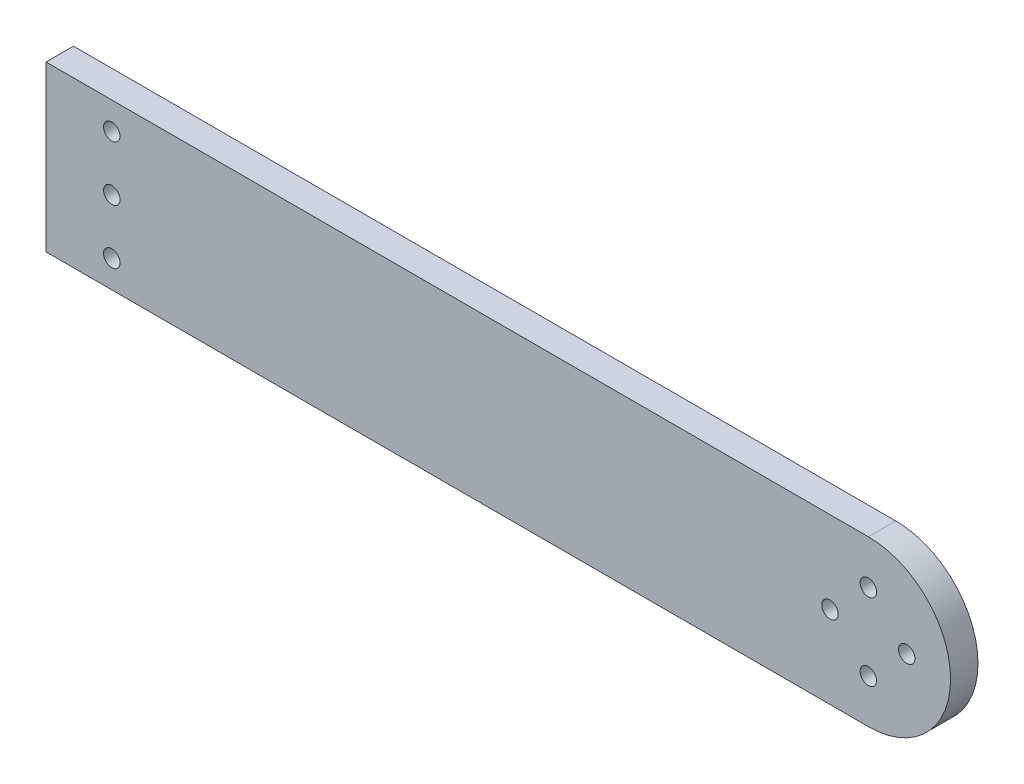
ISO-10303-21;
HEADER;
FILE_DESCRIPTION(('STEP AP214'),'2;1');
FILE_NAME('part.step','',(''),(''),'','','');
FILE_SCHEMA(('AUTOMOTIVE_DESIGN { 1 0 10303 214 1 1 1 1 }'));
ENDSEC;
DATA;
#1=APPLICATION_CONTEXT('core data for automotive mechanical design processes');
#2=APPLICATION_PROTOCOL_DEFINITION('international standard','automotive_design',2000,#1);
#3=PRODUCT_CONTEXT('',#1,'mechanical');
#4=PRODUCT('Part','Part','',(#3));
#5=PRODUCT_RELATED_PRODUCT_CATEGORY('part','',(#4));
#6=PRODUCT_DEFINITION_FORMATION('','',#4);
#7=PRODUCT_DEFINITION_CONTEXT('part definition',#1,'design');
#8=PRODUCT_DEFINITION('design','',#6,#7);
#9=PRODUCT_DEFINITION_SHAPE('','',#8);
#10=(LENGTH_UNIT() NAMED_UNIT(*) SI_UNIT(.MILLI.,.METRE.));
#11=(NAMED_UNIT(*) PLANE_ANGLE_UNIT() SI_UNIT($,.RADIAN.));
#12=(NAMED_UNIT(*) SI_UNIT($,.STERADIAN.) SOLID_ANGLE_UNIT());
#13=UNCERTAINTY_MEASURE_WITH_UNIT(LENGTH_MEASURE(1.E-05),#10,'distance_accuracy_value','');
#14=(GEOMETRIC_REPRESENTATION_CONTEXT(3) GLOBAL_UNCERTAINTY_ASSIGNED_CONTEXT((#13)) GLOBAL_UNIT_ASSIGNED_CONTEXT((#10,
#11,#12)) REPRESENTATION_CONTEXT('',''));
#15=CARTESIAN_POINT('',(0.,0.,0.));
#16=DIRECTION('',(0.,0.,1.));
#17=DIRECTION('',(1.,0.,0.));
#18=AXIS2_PLACEMENT_3D('',#15,#16,#17);
#19=CARTESIAN_POINT('',(74.9999997922791,0.,5.));
#20=DIRECTION('',(0.,0.,1.));
#21=DIRECTION('',(1.,0.,0.));
#22=AXIS2_PLACEMENT_3D('',#19,#20,#21);
#23=PLANE('',#22);
#24=CARTESIAN_POINT('',(-63.0000002077209,10.,5.));
#25=DIRECTION('',(0.,0.,1.));
#26=DIRECTION('',(1.,0.,0.));
#27=AXIS2_PLACEMENT_3D('',#24,#25,#26);
#28=CIRCLE('',#27,1.5);
#29=CARTESIAN_POINT('',(-61.5000002077209,10.,5.));
#30=VERTEX_POINT('',#29);
#31=EDGE_CURVE('E145',#30,#30,#28,.T.);
#32=ORIENTED_EDGE('',*,*,#31,.F.);
#33=EDGE_LOOP('',(#32));
#34=FACE_BOUND('',#33,.T.);
#35=CARTESIAN_POINT('',(75.,-7.,5.));
#36=DIRECTION('',(0.,0.,1.));
#37=DIRECTION('',(-1.,0.,0.));
#38=AXIS2_PLACEMENT_3D('',#35,#36,#37);
#39=CIRCLE('',#38,1.5);
#40=CARTESIAN_POINT('',(73.5,-7.,5.));
#41=VERTEX_POINT('',#40);
#42=EDGE_CURVE('E133',#41,#41,#39,.T.);
#43=ORIENTED_EDGE('',*,*,#42,.F.);
#44=EDGE_LOOP('',(#43));
#45=FACE_BOUND('',#44,.T.);
#46=CARTESIAN_POINT('',(82.,0.,5.));
#47=DIRECTION('',(0.,0.,1.));
#48=DIRECTION('',(1.,0.,0.));
#49=AXIS2_PLACEMENT_3D('',#46,#47,#48);
#50=CIRCLE('',#49,1.5);
#51=CARTESIAN_POINT('',(83.5,0.,5.));
#52=VERTEX_POINT('',#51);
#53=EDGE_CURVE('E121',#52,#52,#50,.T.);
#54=ORIENTED_EDGE('',*,*,#53,.F.);
#55=EDGE_LOOP('',(#54));
#56=FACE_BOUND('',#55,.T.);
#57=DIRECTION('',(0.,-1.,0.));
#58=VECTOR('',#57,1.);
#59=CARTESIAN_POINT('',(-75.0000002077209,-15.,5.));
#60=LINE('',#59,#58);
#61=CARTESIAN_POINT('',(-75.0000002077209,15.,5.));
#62=VERTEX_POINT('',#61);
#63=CARTESIAN_POINT('',(-75.0000002077209,-15.,5.));
#64=VERTEX_POINT('',#63);
#65=EDGE_CURVE('E91',#62,#64,#60,.T.);
#66=ORIENTED_EDGE('',*,*,#65,.T.);
#67=DIRECTION('',(1.,0.,0.));
#68=VECTOR('',#67,1.);
#69=CARTESIAN_POINT('',(75.0000002077208,-15.,5.));
#70=LINE('',#69,#68);
#71=CARTESIAN_POINT('',(75.0000002077208,-15.,5.));
#72=VERTEX_POINT('',#71);
#73=EDGE_CURVE('E86',#64,#72,#70,.T.);
#74=ORIENTED_EDGE('',*,*,#73,.T.);
#75=CARTESIAN_POINT('',(74.9999997922791,0.,5.));
#76=DIRECTION('',(0.,0.,1.));
#77=DIRECTION('',(1.,0.,0.));
#78=AXIS2_PLACEMENT_3D('',#75,#76,#77);
#79=CIRCLE('',#78,15.);
#80=CARTESIAN_POINT('',(75.0000002077209,15.,5.));
#81=VERTEX_POINT('',#80);
#82=EDGE_CURVE('E89',#72,#81,#79,.T.);
#83=ORIENTED_EDGE('',*,*,#82,.T.);
#84=DIRECTION('',(-1.,0.,0.));
#85=VECTOR('',#84,1.);
#86=CARTESIAN_POINT('',(75.0000002077209,15.,5.));
#87=LINE('',#86,#85);
#88=EDGE_CURVE('E56',#81,#62,#87,.T.);
#89=ORIENTED_EDGE('',*,*,#88,.T.);
#90=EDGE_LOOP('',(#66,#74,#83,#89));
#91=FACE_BOUND('',#90,.T.);
#92=CARTESIAN_POINT('',(75.,7.,5.));
#93=DIRECTION('',(0.,0.,1.));
#94=DIRECTION('',(1.,0.,0.));
#95=AXIS2_PLACEMENT_3D('',#92,#93,#94);
#96=CIRCLE('',#95,1.5);
#97=CARTESIAN_POINT('',(76.5,7.,5.));
#98=VERTEX_POINT('',#97);
#99=EDGE_CURVE('E106',#98,#98,#96,.T.);
#100=ORIENTED_EDGE('',*,*,#99,.F.);
#101=EDGE_LOOP('',(#100));
#102=FACE_BOUND('',#101,.T.);
#103=CARTESIAN_POINT('',(68.,0.,5.));
#104=DIRECTION('',(0.,0.,1.));
#105=DIRECTION('',(-1.,0.,0.));
#106=AXIS2_PLACEMENT_3D('',#103,#104,#105);
#107=CIRCLE('',#106,1.5);
#108=CARTESIAN_POINT('',(66.5,0.,5.));
#109=VERTEX_POINT('',#108);
#110=EDGE_CURVE('E127',#109,#109,#107,.T.);
#111=ORIENTED_EDGE('',*,*,#110,.F.);
#112=EDGE_LOOP('',(#111));
#113=FACE_BOUND('',#112,.T.);
#114=CARTESIAN_POINT('',(-63.0000002077209,0.,5.));
#115=DIRECTION('',(0.,0.,1.));
#116=DIRECTION('',(1.,0.,0.));
#117=AXIS2_PLACEMENT_3D('',#114,#115,#116);
#118=CIRCLE('',#117,1.5);
#119=CARTESIAN_POINT('',(-61.5000002077209,0.,5.));
#120=VERTEX_POINT('',#119);
#121=EDGE_CURVE('E139',#120,#120,#118,.T.);
#122=ORIENTED_EDGE('',*,*,#121,.F.);
#123=EDGE_LOOP('',(#122));
#124=FACE_BOUND('',#123,.T.);
#125=CARTESIAN_POINT('',(-63.0000002077209,-10.,5.));
#126=DIRECTION('',(0.,0.,1.));
#127=DIRECTION('',(1.,0.,0.));
#128=AXIS2_PLACEMENT_3D('',#125,#126,#127);
#129=CIRCLE('',#128,1.5);
#130=CARTESIAN_POINT('',(-61.5000002077209,-10.,5.));
#131=VERTEX_POINT('',#130);
#132=EDGE_CURVE('E151',#131,#131,#129,.T.);
#133=ORIENTED_EDGE('',*,*,#132,.F.);
#134=EDGE_LOOP('',(#133));
#135=FACE_BOUND('',#134,.T.);
#136=ADVANCED_FACE('F39',(#34,#45,#56,#91,#102,#113,#124,#135),#23,.T.);
#137=CARTESIAN_POINT('',(74.9999997922791,0.,0.));
#138=DIRECTION('',(0.,0.,1.));
#139=DIRECTION('',(1.,0.,0.));
#140=AXIS2_PLACEMENT_3D('',#137,#138,#139);
#141=PLANE('',#140);
#142=DIRECTION('',(0.,-1.,0.));
#143=VECTOR('',#142,1.);
#144=CARTESIAN_POINT('',(-75.0000002077209,-15.,0.));
#145=LINE('',#144,#143);
#146=CARTESIAN_POINT('',(-75.0000002077209,15.,0.));
#147=VERTEX_POINT('',#146);
#148=CARTESIAN_POINT('',(-75.0000002077209,-15.,0.));
#149=VERTEX_POINT('',#148);
#150=EDGE_CURVE('E103',#147,#149,#145,.T.);
#151=ORIENTED_EDGE('',*,*,#150,.F.);
#152=DIRECTION('',(-1.,0.,0.));
#153=VECTOR('',#152,1.);
#154=CARTESIAN_POINT('',(75.0000002077209,15.,0.));
#155=LINE('',#154,#153);
#156=CARTESIAN_POINT('',(75.0000002077209,15.,0.));
#157=VERTEX_POINT('',#156);
#158=EDGE_CURVE('E79',#157,#147,#155,.T.);
#159=ORIENTED_EDGE('',*,*,#158,.F.);
#160=CARTESIAN_POINT('',(74.9999997922791,0.,0.));
#161=DIRECTION('',(0.,0.,1.));
#162=DIRECTION('',(1.,0.,0.));
#163=AXIS2_PLACEMENT_3D('',#160,#161,#162);
#164=CIRCLE('',#163,15.);
#165=CARTESIAN_POINT('',(75.0000002077208,-15.,0.));
#166=VERTEX_POINT('',#165);
#167=EDGE_CURVE('E73',#166,#157,#164,.T.);
#168=ORIENTED_EDGE('',*,*,#167,.F.);
#169=DIRECTION('',(1.,0.,0.));
#170=VECTOR('',#169,1.);
#171=CARTESIAN_POINT('',(75.0000002077208,-15.,0.));
#172=LINE('',#171,#170);
#173=EDGE_CURVE('E95',#149,#166,#172,.T.);
#174=ORIENTED_EDGE('',*,*,#173,.F.);
#175=EDGE_LOOP('',(#151,#159,#168,#174));
#176=FACE_BOUND('',#175,.T.);
#177=CARTESIAN_POINT('',(75.,7.,0.));
#178=DIRECTION('',(0.,0.,1.));
#179=DIRECTION('',(1.,0.,0.));
#180=AXIS2_PLACEMENT_3D('',#177,#178,#179);
#181=CIRCLE('',#180,1.5);
#182=CARTESIAN_POINT('',(76.5,7.,0.));
#183=VERTEX_POINT('',#182);
#184=EDGE_CURVE('E118',#183,#183,#181,.T.);
#185=ORIENTED_EDGE('',*,*,#184,.T.);
#186=EDGE_LOOP('',(#185));
#187=FACE_BOUND('',#186,.T.);
#188=CARTESIAN_POINT('',(82.,0.,0.));
#189=DIRECTION('',(0.,0.,1.));
#190=DIRECTION('',(1.,0.,0.));
#191=AXIS2_PLACEMENT_3D('',#188,#189,#190);
#192=CIRCLE('',#191,1.5);
#193=CARTESIAN_POINT('',(83.5,0.,0.));
#194=VERTEX_POINT('',#193);
#195=EDGE_CURVE('E124',#194,#194,#192,.T.);
#196=ORIENTED_EDGE('',*,*,#195,.T.);
#197=EDGE_LOOP('',(#196));
#198=FACE_BOUND('',#197,.T.);
#199=CARTESIAN_POINT('',(68.,0.,0.));
#200=DIRECTION('',(0.,0.,1.));
#201=DIRECTION('',(-1.,0.,0.));
#202=AXIS2_PLACEMENT_3D('',#199,#200,#201);
#203=CIRCLE('',#202,1.5);
#204=CARTESIAN_POINT('',(66.5,0.,0.));
#205=VERTEX_POINT('',#204);
#206=EDGE_CURVE('E130',#205,#205,#203,.T.);
#207=ORIENTED_EDGE('',*,*,#206,.T.);
#208=EDGE_LOOP('',(#207));
#209=FACE_BOUND('',#208,.T.);
#210=CARTESIAN_POINT('',(75.,-7.,0.));
#211=DIRECTION('',(0.,0.,1.));
#212=DIRECTION('',(-1.,0.,0.));
#213=AXIS2_PLACEMENT_3D('',#210,#211,#212);
#214=CIRCLE('',#213,1.5);
#215=CARTESIAN_POINT('',(73.5,-7.,0.));
#216=VERTEX_POINT('',#215);
#217=EDGE_CURVE('E136',#216,#216,#214,.T.);
#218=ORIENTED_EDGE('',*,*,#217,.T.);
#219=EDGE_LOOP('',(#218));
#220=FACE_BOUND('',#219,.T.);
#221=CARTESIAN_POINT('',(-63.0000002077209,0.,0.));
#222=DIRECTION('',(0.,0.,1.));
#223=DIRECTION('',(1.,0.,0.));
#224=AXIS2_PLACEMENT_3D('',#221,#222,#223);
#225=CIRCLE('',#224,1.5);
#226=CARTESIAN_POINT('',(-61.5000002077209,0.,0.));
#227=VERTEX_POINT('',#226);
#228=EDGE_CURVE('E142',#227,#227,#225,.T.);
#229=ORIENTED_EDGE('',*,*,#228,.T.);
#230=EDGE_LOOP('',(#229));
#231=FACE_BOUND('',#230,.T.);
#232=CARTESIAN_POINT('',(-63.0000002077209,10.,0.));
#233=DIRECTION('',(0.,0.,1.));
#234=DIRECTION('',(1.,0.,0.));
#235=AXIS2_PLACEMENT_3D('',#232,#233,#234);
#236=CIRCLE('',#235,1.5);
#237=CARTESIAN_POINT('',(-61.5000002077209,10.,0.));
#238=VERTEX_POINT('',#237);
#239=EDGE_CURVE('E148',#238,#238,#236,.T.);
#240=ORIENTED_EDGE('',*,*,#239,.T.);
#241=EDGE_LOOP('',(#240));
#242=FACE_BOUND('',#241,.T.);
#243=CARTESIAN_POINT('',(-63.0000002077209,-10.,0.));
#244=DIRECTION('',(0.,0.,1.));
#245=DIRECTION('',(1.,0.,0.));
#246=AXIS2_PLACEMENT_3D('',#243,#244,#245);
#247=CIRCLE('',#246,1.5);
#248=CARTESIAN_POINT('',(-61.5000002077209,-10.,0.));
#249=VERTEX_POINT('',#248);
#250=EDGE_CURVE('E154',#249,#249,#247,.T.);
#251=ORIENTED_EDGE('',*,*,#250,.T.);
#252=EDGE_LOOP('',(#251));
#253=FACE_BOUND('',#252,.T.);
#254=ADVANCED_FACE('F114',(#176,#187,#198,#209,#220,#231,#242,#253),#141,.F.);
#255=CARTESIAN_POINT('',(-75.0000002077209,-15.,5.));
#256=DIRECTION('',(1.,0.,0.));
#257=DIRECTION('',(0.,0.,-1.));
#258=AXIS2_PLACEMENT_3D('',#255,#256,#257);
#259=PLANE('',#258);
#260=ORIENTED_EDGE('',*,*,#150,.T.);
#261=DIRECTION('',(0.,0.,-1.));
#262=VECTOR('',#261,1.);
#263=CARTESIAN_POINT('',(-75.0000002077209,-15.,5.));
#264=LINE('',#263,#262);
#265=EDGE_CURVE('E11',#64,#149,#264,.T.);
#266=ORIENTED_EDGE('',*,*,#265,.F.);
#267=ORIENTED_EDGE('',*,*,#65,.F.);
#268=DIRECTION('',(0.,0.,-1.));
#269=VECTOR('',#268,1.);
#270=CARTESIAN_POINT('',(-75.0000002077209,15.,5.));
#271=LINE('',#270,#269);
#272=EDGE_CURVE('E99',#62,#147,#271,.T.);
#273=ORIENTED_EDGE('',*,*,#272,.T.);
#274=EDGE_LOOP('',(#260,#266,#267,#273));
#275=FACE_BOUND('',#274,.T.);
#276=ADVANCED_FACE('F41',(#275),#259,.F.);
#277=CARTESIAN_POINT('',(75.0000002077208,-15.,5.));
#278=DIRECTION('',(0.,1.,0.));
#279=DIRECTION('',(0.,0.,1.));
#280=AXIS2_PLACEMENT_3D('',#277,#278,#279);
#281=PLANE('',#280);
#282=ORIENTED_EDGE('',*,*,#173,.T.);
#283=DIRECTION('',(0.,0.,-1.));
#284=VECTOR('',#283,1.);
#285=CARTESIAN_POINT('',(75.0000002077208,-15.,5.));
#286=LINE('',#285,#284);
#287=EDGE_CURVE('E48',#72,#166,#286,.T.);
#288=ORIENTED_EDGE('',*,*,#287,.F.);
#289=ORIENTED_EDGE('',*,*,#73,.F.);
#290=ORIENTED_EDGE('',*,*,#265,.T.);
#291=EDGE_LOOP('',(#282,#288,#289,#290));
#292=FACE_BOUND('',#291,.T.);
#293=ADVANCED_FACE('F94',(#292),#281,.F.);
#294=CARTESIAN_POINT('',(74.9999997922791,0.,5.));
#295=DIRECTION('',(0.,0.,-1.));
#296=DIRECTION('',(-1.,0.,0.));
#297=AXIS2_PLACEMENT_3D('',#294,#295,#296);
#298=CYLINDRICAL_SURFACE('',#297,15.);
#299=ORIENTED_EDGE('',*,*,#167,.T.);
#300=DIRECTION('',(0.,0.,-1.));
#301=VECTOR('',#300,1.);
#302=CARTESIAN_POINT('',(75.0000002077209,15.,5.));
#303=LINE('',#302,#301);
#304=EDGE_CURVE('E96',#81,#157,#303,.T.);
#305=ORIENTED_EDGE('',*,*,#304,.F.);
#306=ORIENTED_EDGE('',*,*,#82,.F.);
#307=ORIENTED_EDGE('',*,*,#287,.T.);
#308=EDGE_LOOP('',(#299,#305,#306,#307));
#309=FACE_BOUND('',#308,.T.);
#310=ADVANCED_FACE('F97',(#309),#298,.T.);
#311=CARTESIAN_POINT('',(75.0000002077209,15.,5.));
#312=DIRECTION('',(0.,-1.,0.));
#313=DIRECTION('',(0.,0.,-1.));
#314=AXIS2_PLACEMENT_3D('',#311,#312,#313);
#315=PLANE('',#314);
#316=ORIENTED_EDGE('',*,*,#158,.T.);
#317=ORIENTED_EDGE('',*,*,#272,.F.);
#318=ORIENTED_EDGE('',*,*,#88,.F.);
#319=ORIENTED_EDGE('',*,*,#304,.T.);
#320=EDGE_LOOP('',(#316,#317,#318,#319));
#321=FACE_BOUND('',#320,.T.);
#322=ADVANCED_FACE('F111',(#321),#315,.F.);
#323=CARTESIAN_POINT('',(75.,7.,5.));
#324=DIRECTION('',(0.,0.,-1.));
#325=DIRECTION('',(-1.,0.,0.));
#326=AXIS2_PLACEMENT_3D('',#323,#324,#325);
#327=CYLINDRICAL_SURFACE('',#326,1.5);
#328=ORIENTED_EDGE('',*,*,#99,.T.);
#329=EDGE_LOOP('',(#328));
#330=FACE_BOUND('',#329,.T.);
#331=ORIENTED_EDGE('',*,*,#184,.F.);
#332=EDGE_LOOP('',(#331));
#333=FACE_BOUND('',#332,.T.);
#334=ADVANCED_FACE('F173',(#330,#333),#327,.F.);
#335=CARTESIAN_POINT('',(82.,0.,5.));
#336=DIRECTION('',(0.,0.,-1.));
#337=DIRECTION('',(-1.,0.,0.));
#338=AXIS2_PLACEMENT_3D('',#335,#336,#337);
#339=CYLINDRICAL_SURFACE('',#338,1.5);
#340=ORIENTED_EDGE('',*,*,#53,.T.);
#341=EDGE_LOOP('',(#340));
#342=FACE_BOUND('',#341,.T.);
#343=ORIENTED_EDGE('',*,*,#195,.F.);
#344=EDGE_LOOP('',(#343));
#345=FACE_BOUND('',#344,.T.);
#346=ADVANCED_FACE('F218',(#342,#345),#339,.F.);
#347=CARTESIAN_POINT('',(68.,0.,5.));
#348=DIRECTION('',(0.,0.,-1.));
#349=DIRECTION('',(-1.,0.,0.));
#350=AXIS2_PLACEMENT_3D('',#347,#348,#349);
#351=CYLINDRICAL_SURFACE('',#350,1.5);
#352=ORIENTED_EDGE('',*,*,#110,.T.);
#353=EDGE_LOOP('',(#352));
#354=FACE_BOUND('',#353,.T.);
#355=ORIENTED_EDGE('',*,*,#206,.F.);
#356=EDGE_LOOP('',(#355));
#357=FACE_BOUND('',#356,.T.);
#358=ADVANCED_FACE('F226',(#354,#357),#351,.F.);
#359=CARTESIAN_POINT('',(75.,-7.,5.));
#360=DIRECTION('',(0.,0.,-1.));
#361=DIRECTION('',(-1.,0.,0.));
#362=AXIS2_PLACEMENT_3D('',#359,#360,#361);
#363=CYLINDRICAL_SURFACE('',#362,1.5);
#364=ORIENTED_EDGE('',*,*,#42,.T.);
#365=EDGE_LOOP('',(#364));
#366=FACE_BOUND('',#365,.T.);
#367=ORIENTED_EDGE('',*,*,#217,.F.);
#368=EDGE_LOOP('',(#367));
#369=FACE_BOUND('',#368,.T.);
#370=ADVANCED_FACE('F234',(#366,#369),#363,.F.);
#371=CARTESIAN_POINT('',(-63.0000002077209,0.,5.));
#372=DIRECTION('',(0.,0.,-1.));
#373=DIRECTION('',(-1.,0.,0.));
#374=AXIS2_PLACEMENT_3D('',#371,#372,#373);
#375=CYLINDRICAL_SURFACE('',#374,1.5);
#376=ORIENTED_EDGE('',*,*,#121,.T.);
#377=EDGE_LOOP('',(#376));
#378=FACE_BOUND('',#377,.T.);
#379=ORIENTED_EDGE('',*,*,#228,.F.);
#380=EDGE_LOOP('',(#379));
#381=FACE_BOUND('',#380,.T.);
#382=ADVANCED_FACE('F243',(#378,#381),#375,.F.);
#383=CARTESIAN_POINT('',(-63.0000002077209,10.,5.));
#384=DIRECTION('',(0.,0.,-1.));
#385=DIRECTION('',(-1.,0.,0.));
#386=AXIS2_PLACEMENT_3D('',#383,#384,#385);
#387=CYLINDRICAL_SURFACE('',#386,1.5);
#388=ORIENTED_EDGE('',*,*,#31,.T.);
#389=EDGE_LOOP('',(#388));
#390=FACE_BOUND('',#389,.T.);
#391=ORIENTED_EDGE('',*,*,#239,.F.);
#392=EDGE_LOOP('',(#391));
#393=FACE_BOUND('',#392,.T.);
#394=ADVANCED_FACE('F252',(#390,#393),#387,.F.);
#395=CARTESIAN_POINT('',(-63.0000002077209,-10.,5.));
#396=DIRECTION('',(0.,0.,-1.));
#397=DIRECTION('',(-1.,0.,0.));
#398=AXIS2_PLACEMENT_3D('',#395,#396,#397);
#399=CYLINDRICAL_SURFACE('',#398,1.5);
#400=ORIENTED_EDGE('',*,*,#132,.T.);
#401=EDGE_LOOP('',(#400));
#402=FACE_BOUND('',#401,.T.);
#403=ORIENTED_EDGE('',*,*,#250,.F.);
#404=EDGE_LOOP('',(#403));
#405=FACE_BOUND('',#404,.T.);
#406=ADVANCED_FACE('F160',(#402,#405),#399,.F.);
#407=CLOSED_SHELL('',(#136,#254,#276,#293,#310,#322,#334,#346,#358,#370,#382,#394,#406));
#408=MANIFOLD_SOLID_BREP('B2',#407);
#409=ADVANCED_BREP_SHAPE_REPRESENTATION('',(#18,#408),#14);
#410=SHAPE_DEFINITION_REPRESENTATION(#9,#409);
ENDSEC;
END-ISO-10303-21;
